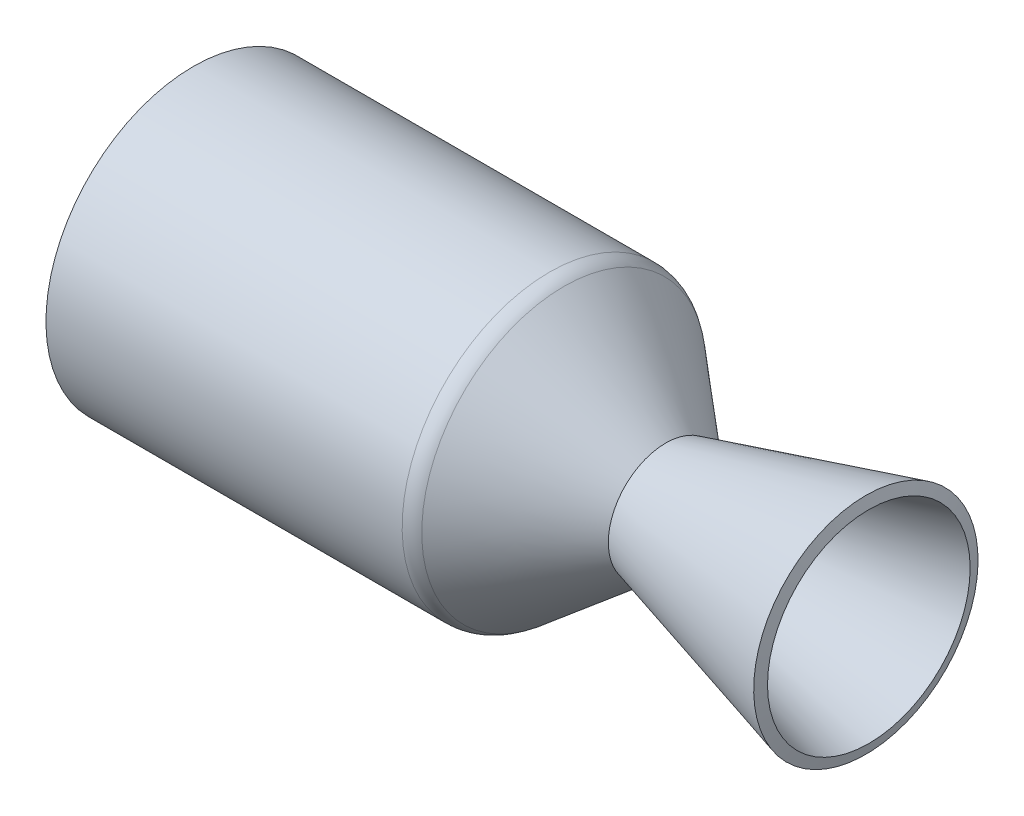
ISO-10303-21;
HEADER;
FILE_DESCRIPTION(('STEP AP214'),'2;1');
FILE_NAME('part.step','',(''),(''),'','','');
FILE_SCHEMA(('AUTOMOTIVE_DESIGN { 1 0 10303 214 1 1 1 1 }'));
ENDSEC;
DATA;
#1=APPLICATION_CONTEXT('core data for automotive mechanical design processes');
#2=APPLICATION_PROTOCOL_DEFINITION('international standard','automotive_design',2000,#1);
#3=PRODUCT_CONTEXT('',#1,'mechanical');
#4=PRODUCT('Part','Part','',(#3));
#5=PRODUCT_RELATED_PRODUCT_CATEGORY('part','',(#4));
#6=PRODUCT_DEFINITION_FORMATION('','',#4);
#7=PRODUCT_DEFINITION_CONTEXT('part definition',#1,'design');
#8=PRODUCT_DEFINITION('design','',#6,#7);
#9=PRODUCT_DEFINITION_SHAPE('','',#8);
#10=(LENGTH_UNIT() NAMED_UNIT(*) SI_UNIT(.MILLI.,.METRE.));
#11=(NAMED_UNIT(*) PLANE_ANGLE_UNIT() SI_UNIT($,.RADIAN.));
#12=(NAMED_UNIT(*) SI_UNIT($,.STERADIAN.) SOLID_ANGLE_UNIT());
#13=UNCERTAINTY_MEASURE_WITH_UNIT(LENGTH_MEASURE(1.E-05),#10,'distance_accuracy_value','');
#14=(GEOMETRIC_REPRESENTATION_CONTEXT(3) GLOBAL_UNCERTAINTY_ASSIGNED_CONTEXT((#13)) GLOBAL_UNIT_ASSIGNED_CONTEXT((#10,
#11,#12)) REPRESENTATION_CONTEXT('',''));
#15=CARTESIAN_POINT('',(0.,0.,0.));
#16=DIRECTION('',(0.,0.,1.));
#17=DIRECTION('',(1.,0.,0.));
#18=AXIS2_PLACEMENT_3D('',#15,#16,#17);
#19=CARTESIAN_POINT('',(-103.075250337826,65.4514224929439,0.));
#20=DIRECTION('',(-1.,0.,0.));
#21=DIRECTION('',(0.,-1.,0.));
#22=AXIS2_PLACEMENT_3D('',#19,#20,#21);
#23=PLANE('',#22);
#24=CARTESIAN_POINT('',(-103.075250337826,0.,0.));
#25=DIRECTION('',(1.,0.,0.));
#26=DIRECTION('',(0.,1.,0.));
#27=AXIS2_PLACEMENT_3D('',#24,#25,#26);
#28=CIRCLE('',#27,60.4514224929439);
#29=CARTESIAN_POINT('',(-103.075250337826,60.4514224929439,0.));
#30=VERTEX_POINT('',#29);
#31=EDGE_CURVE('E90',#30,#30,#28,.T.);
#32=ORIENTED_EDGE('',*,*,#31,.T.);
#33=EDGE_LOOP('',(#32));
#34=FACE_BOUND('',#33,.T.);
#35=CARTESIAN_POINT('',(-103.075250337826,0.,0.));
#36=DIRECTION('',(1.,0.,0.));
#37=DIRECTION('',(0.,1.,0.));
#38=AXIS2_PLACEMENT_3D('',#35,#36,#37);
#39=CIRCLE('',#38,65.4514224929439);
#40=CARTESIAN_POINT('',(-103.075250337826,65.4514224929439,0.));
#41=VERTEX_POINT('',#40);
#42=EDGE_CURVE('E10',#41,#41,#39,.T.);
#43=ORIENTED_EDGE('',*,*,#42,.F.);
#44=EDGE_LOOP('',(#43));
#45=FACE_BOUND('',#44,.T.);
#46=ADVANCED_FACE('F43',(#34,#45),#23,.T.);
#47=CARTESIAN_POINT('',(196.924749662174,0.,0.));
#48=DIRECTION('',(1.,0.,0.));
#49=DIRECTION('',(0.,1.,0.));
#50=AXIS2_PLACEMENT_3D('',#47,#48,#49);
#51=CYLINDRICAL_SURFACE('',#50,65.4514224929439);
#52=ORIENTED_EDGE('',*,*,#42,.T.);
#53=EDGE_LOOP('',(#52));
#54=FACE_BOUND('',#53,.T.);
#55=CARTESIAN_POINT('',(55.1164687395599,0.,0.));
#56=DIRECTION('',(1.,0.,0.));
#57=DIRECTION('',(0.,1.,0.));
#58=AXIS2_PLACEMENT_3D('',#55,#56,#57);
#59=CIRCLE('',#58,65.4514224929439);
#60=CARTESIAN_POINT('',(55.1164687395599,65.4514224929439,0.));
#61=VERTEX_POINT('',#60);
#62=EDGE_CURVE('E50',#61,#61,#59,.T.);
#63=ORIENTED_EDGE('',*,*,#62,.F.);
#64=EDGE_LOOP('',(#63));
#65=FACE_BOUND('',#64,.T.);
#66=ADVANCED_FACE('F109',(#54,#65),#51,.T.);
#67=CARTESIAN_POINT('',(55.11646873956,0.,0.));
#68=DIRECTION('',(1.,0.,0.));
#69=DIRECTION('',(0.,1.,0.));
#70=AXIS2_PLACEMENT_3D('',#67,#68,#69);
#71=TOROIDAL_SURFACE('',#70,55.4514224929439,10.);
#72=ORIENTED_EDGE('',*,*,#62,.T.);
#73=EDGE_LOOP('',(#72));
#74=FACE_BOUND('',#73,.T.);
#75=CARTESIAN_POINT('',(61.5129618598864,0.,0.));
#76=DIRECTION('',(1.,0.,0.));
#77=DIRECTION('',(0.,1.,0.));
#78=AXIS2_PLACEMENT_3D('',#75,#76,#77);
#79=CIRCLE('',#78,63.1380911967204);
#80=CARTESIAN_POINT('',(61.5129618598864,63.1380911967204,0.));
#81=VERTEX_POINT('',#80);
#82=EDGE_CURVE('E55',#81,#81,#79,.T.);
#83=ORIENTED_EDGE('',*,*,#82,.F.);
#84=EDGE_LOOP('',(#83));
#85=FACE_BOUND('',#84,.T.);
#86=ADVANCED_FACE('F113',(#74,#85),#71,.T.);
#87=CARTESIAN_POINT('',(106.73000878765,0.,0.));
#88=DIRECTION('',(-1.,0.,0.));
#89=DIRECTION('',(0.,-1.,0.));
#90=AXIS2_PLACEMENT_3D('',#87,#88,#89);
#91=CONICAL_SURFACE('',#90,25.5105387756293,0.694041950169031);
#92=ORIENTED_EDGE('',*,*,#82,.T.);
#93=EDGE_LOOP('',(#92));
#94=FACE_BOUND('',#93,.T.);
#95=CARTESIAN_POINT('',(106.73000878765,0.,0.));
#96=DIRECTION('',(1.,0.,0.));
#97=DIRECTION('',(0.,1.,0.));
#98=AXIS2_PLACEMENT_3D('',#95,#96,#97);
#99=CIRCLE('',#98,25.5105387756293);
#100=CARTESIAN_POINT('',(106.73000878765,25.5105387756293,0.));
#101=VERTEX_POINT('',#100);
#102=EDGE_CURVE('E60',#101,#101,#99,.T.);
#103=ORIENTED_EDGE('',*,*,#102,.F.);
#104=EDGE_LOOP('',(#103));
#105=FACE_BOUND('',#104,.T.);
#106=ADVANCED_FACE('F117',(#94,#105),#91,.T.);
#107=CARTESIAN_POINT('',(195.605450203628,0.,0.));
#108=DIRECTION('',(1.,0.,0.));
#109=DIRECTION('',(0.,1.,0.));
#110=AXIS2_PLACEMENT_3D('',#107,#108,#109);
#111=CONICAL_SURFACE('',#110,49.8228050902645,0.267021733825283);
#112=ORIENTED_EDGE('',*,*,#102,.T.);
#113=EDGE_LOOP('',(#112));
#114=FACE_BOUND('',#113,.T.);
#115=CARTESIAN_POINT('',(195.605450203628,0.,0.));
#116=DIRECTION('',(1.,0.,0.));
#117=DIRECTION('',(0.,1.,0.));
#118=AXIS2_PLACEMENT_3D('',#115,#116,#117);
#119=CIRCLE('',#118,49.8228050902645);
#120=CARTESIAN_POINT('',(195.605450203628,49.8228050902645,0.));
#121=VERTEX_POINT('',#120);
#122=EDGE_CURVE('E66',#121,#121,#119,.T.);
#123=ORIENTED_EDGE('',*,*,#122,.F.);
#124=EDGE_LOOP('',(#123));
#125=FACE_BOUND('',#124,.T.);
#126=ADVANCED_FACE('F123',(#114,#125),#111,.T.);
#127=CARTESIAN_POINT('',(196.924749662174,0.,0.));
#128=DIRECTION('',(-1.,0.,0.));
#129=DIRECTION('',(0.,-1.,0.));
#130=AXIS2_PLACEMENT_3D('',#127,#128,#129);
#131=CONICAL_SURFACE('',#130,45.,1.30377459296961);
#132=ORIENTED_EDGE('',*,*,#122,.T.);
#133=EDGE_LOOP('',(#132));
#134=FACE_BOUND('',#133,.T.);
#135=CARTESIAN_POINT('',(196.924749662174,0.,0.));
#136=DIRECTION('',(1.,0.,0.));
#137=DIRECTION('',(0.,1.,0.));
#138=AXIS2_PLACEMENT_3D('',#135,#136,#137);
#139=CIRCLE('',#138,45.);
#140=CARTESIAN_POINT('',(196.924749662174,45.,0.));
#141=VERTEX_POINT('',#140);
#142=EDGE_CURVE('E70',#141,#141,#139,.T.);
#143=ORIENTED_EDGE('',*,*,#142,.F.);
#144=EDGE_LOOP('',(#143));
#145=FACE_BOUND('',#144,.T.);
#146=ADVANCED_FACE('F127',(#134,#145),#131,.T.);
#147=CARTESIAN_POINT('',(108.049308246195,0.,0.));
#148=DIRECTION('',(1.,0.,0.));
#149=DIRECTION('',(0.,1.,0.));
#150=AXIS2_PLACEMENT_3D('',#147,#148,#149);
#151=CONICAL_SURFACE('',#150,20.6877336853647,0.267021733825283);
#152=ORIENTED_EDGE('',*,*,#142,.T.);
#153=EDGE_LOOP('',(#152));
#154=FACE_BOUND('',#153,.T.);
#155=CARTESIAN_POINT('',(108.049308246195,0.,0.));
#156=DIRECTION('',(1.,0.,0.));
#157=DIRECTION('',(0.,1.,0.));
#158=AXIS2_PLACEMENT_3D('',#155,#156,#157);
#159=CIRCLE('',#158,20.6877336853647);
#160=CARTESIAN_POINT('',(108.049308246195,20.6877336853647,0.));
#161=VERTEX_POINT('',#160);
#162=EDGE_CURVE('E74',#161,#161,#159,.T.);
#163=ORIENTED_EDGE('',*,*,#162,.F.);
#164=EDGE_LOOP('',(#163));
#165=FACE_BOUND('',#164,.T.);
#166=ADVANCED_FACE('F131',(#154,#165),#151,.F.);
#167=CARTESIAN_POINT('',(106.73000878765,0.,0.));
#168=DIRECTION('',(1.,0.,0.));
#169=DIRECTION('',(0.,1.,0.));
#170=AXIS2_PLACEMENT_3D('',#167,#168,#169);
#171=TOROIDAL_SURFACE('',#170,25.5105387756293,5.);
#172=ORIENTED_EDGE('',*,*,#162,.T.);
#173=EDGE_LOOP('',(#172));
#174=FACE_BOUND('',#173,.T.);
#175=CARTESIAN_POINT('',(103.531762227487,0.,0.));
#176=DIRECTION('',(1.,0.,0.));
#177=DIRECTION('',(0.,1.,0.));
#178=AXIS2_PLACEMENT_3D('',#175,#176,#177);
#179=CIRCLE('',#178,21.667204423741);
#180=CARTESIAN_POINT('',(103.531762227487,21.667204423741,0.));
#181=VERTEX_POINT('',#180);
#182=EDGE_CURVE('E78',#181,#181,#179,.T.);
#183=ORIENTED_EDGE('',*,*,#182,.F.);
#184=EDGE_LOOP('',(#183));
#185=FACE_BOUND('',#184,.T.);
#186=ADVANCED_FACE('F135',(#174,#185),#171,.T.);
#187=CARTESIAN_POINT('',(58.3147152997232,0.,0.));
#188=DIRECTION('',(-1.,0.,0.));
#189=DIRECTION('',(0.,-1.,0.));
#190=AXIS2_PLACEMENT_3D('',#187,#188,#189);
#191=CONICAL_SURFACE('',#190,59.2947568448321,0.694041950169031);
#192=ORIENTED_EDGE('',*,*,#182,.T.);
#193=EDGE_LOOP('',(#192));
#194=FACE_BOUND('',#193,.T.);
#195=CARTESIAN_POINT('',(58.3147152997232,0.,0.));
#196=DIRECTION('',(1.,0.,0.));
#197=DIRECTION('',(0.,1.,0.));
#198=AXIS2_PLACEMENT_3D('',#195,#196,#197);
#199=CIRCLE('',#198,59.2947568448321);
#200=CARTESIAN_POINT('',(58.3147152997232,59.2947568448321,0.));
#201=VERTEX_POINT('',#200);
#202=EDGE_CURVE('E82',#201,#201,#199,.T.);
#203=ORIENTED_EDGE('',*,*,#202,.F.);
#204=EDGE_LOOP('',(#203));
#205=FACE_BOUND('',#204,.T.);
#206=ADVANCED_FACE('F105',(#194,#205),#191,.F.);
#207=CARTESIAN_POINT('',(55.11646873956,0.,0.));
#208=DIRECTION('',(1.,0.,0.));
#209=DIRECTION('',(0.,1.,0.));
#210=AXIS2_PLACEMENT_3D('',#207,#208,#209);
#211=TOROIDAL_SURFACE('',#210,55.4514224929439,5.);
#212=ORIENTED_EDGE('',*,*,#202,.T.);
#213=EDGE_LOOP('',(#212));
#214=FACE_BOUND('',#213,.T.);
#215=CARTESIAN_POINT('',(55.1164687395599,0.,0.));
#216=DIRECTION('',(1.,0.,0.));
#217=DIRECTION('',(0.,1.,0.));
#218=AXIS2_PLACEMENT_3D('',#215,#216,#217);
#219=CIRCLE('',#218,60.4514224929439);
#220=CARTESIAN_POINT('',(55.1164687395599,60.4514224929439,0.));
#221=VERTEX_POINT('',#220);
#222=EDGE_CURVE('E86',#221,#221,#219,.T.);
#223=ORIENTED_EDGE('',*,*,#222,.F.);
#224=EDGE_LOOP('',(#223));
#225=FACE_BOUND('',#224,.T.);
#226=ADVANCED_FACE('F99',(#214,#225),#211,.F.);
#227=CARTESIAN_POINT('',(196.924749662174,0.,0.));
#228=DIRECTION('',(1.,0.,0.));
#229=DIRECTION('',(0.,1.,0.));
#230=AXIS2_PLACEMENT_3D('',#227,#228,#229);
#231=CYLINDRICAL_SURFACE('',#230,60.4514224929439);
#232=ORIENTED_EDGE('',*,*,#222,.T.);
#233=EDGE_LOOP('',(#232));
#234=FACE_BOUND('',#233,.T.);
#235=ORIENTED_EDGE('',*,*,#31,.F.);
#236=EDGE_LOOP('',(#235));
#237=FACE_BOUND('',#236,.T.);
#238=ADVANCED_FACE('F97',(#234,#237),#231,.F.);
#239=CLOSED_SHELL('',(#46,#66,#86,#106,#126,#146,#166,#186,#206,#226,#238));
#240=MANIFOLD_SOLID_BREP('B2',#239);
#241=ADVANCED_BREP_SHAPE_REPRESENTATION('',(#18,#240),#14);
#242=SHAPE_DEFINITION_REPRESENTATION(#9,#241);
ENDSEC;
END-ISO-10303-21;
